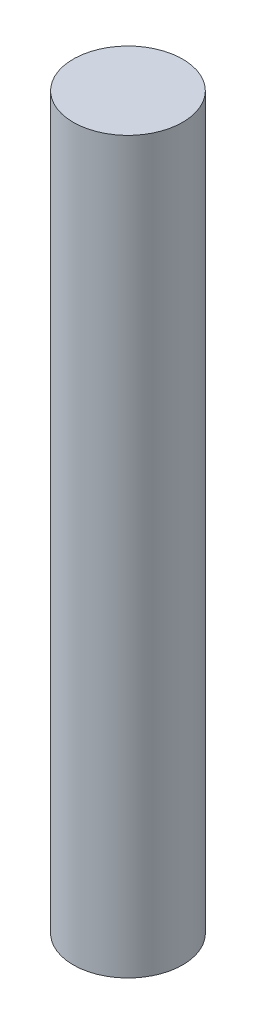
ISO-10303-21;
HEADER;
FILE_DESCRIPTION(('STEP AP214'),'2;1');
FILE_NAME('part.step','',(''),(''),'','','');
FILE_SCHEMA(('AUTOMOTIVE_DESIGN { 1 0 10303 214 1 1 1 1 }'));
ENDSEC;
DATA;
#1=APPLICATION_CONTEXT('core data for automotive mechanical design processes');
#2=APPLICATION_PROTOCOL_DEFINITION('international standard','automotive_design',2000,#1);
#3=PRODUCT_CONTEXT('',#1,'mechanical');
#4=PRODUCT('Part','Part','',(#3));
#5=PRODUCT_RELATED_PRODUCT_CATEGORY('part','',(#4));
#6=PRODUCT_DEFINITION_FORMATION('','',#4);
#7=PRODUCT_DEFINITION_CONTEXT('part definition',#1,'design');
#8=PRODUCT_DEFINITION('design','',#6,#7);
#9=PRODUCT_DEFINITION_SHAPE('','',#8);
#10=(LENGTH_UNIT() NAMED_UNIT(*) SI_UNIT(.MILLI.,.METRE.));
#11=(NAMED_UNIT(*) PLANE_ANGLE_UNIT() SI_UNIT($,.RADIAN.));
#12=(NAMED_UNIT(*) SI_UNIT($,.STERADIAN.) SOLID_ANGLE_UNIT());
#13=UNCERTAINTY_MEASURE_WITH_UNIT(LENGTH_MEASURE(1.E-05),#10,'distance_accuracy_value','');
#14=(GEOMETRIC_REPRESENTATION_CONTEXT(3) GLOBAL_UNCERTAINTY_ASSIGNED_CONTEXT((#13)) GLOBAL_UNIT_ASSIGNED_CONTEXT((#10,
#11,#12)) REPRESENTATION_CONTEXT('',''));
#15=CARTESIAN_POINT('',(0.,0.,0.));
#16=DIRECTION('',(0.,0.,1.));
#17=DIRECTION('',(1.,0.,0.));
#18=AXIS2_PLACEMENT_3D('',#15,#16,#17);
#19=CARTESIAN_POINT('',(0.,10.,0.));
#20=DIRECTION('',(0.,-1.,0.));
#21=DIRECTION('',(0.,0.,-1.));
#22=AXIS2_PLACEMENT_3D('',#19,#20,#21);
#23=CYLINDRICAL_SURFACE('',#22,0.75);
#24=CARTESIAN_POINT('',(0.,10.,0.));
#25=DIRECTION('',(0.,1.,0.));
#26=DIRECTION('',(0.,0.,1.));
#27=AXIS2_PLACEMENT_3D('',#24,#25,#26);
#28=CIRCLE('',#27,0.75);
#29=CARTESIAN_POINT('',(0.,10.,0.75));
#30=VERTEX_POINT('',#29);
#31=EDGE_CURVE('E10',#30,#30,#28,.T.);
#32=ORIENTED_EDGE('',*,*,#31,.F.);
#33=EDGE_LOOP('',(#32));
#34=FACE_BOUND('',#33,.T.);
#35=CARTESIAN_POINT('',(0.,0.,0.));
#36=DIRECTION('',(0.,1.,0.));
#37=DIRECTION('',(0.,0.,1.));
#38=AXIS2_PLACEMENT_3D('',#35,#36,#37);
#39=CIRCLE('',#38,0.75);
#40=CARTESIAN_POINT('',(0.,0.,0.75));
#41=VERTEX_POINT('',#40);
#42=EDGE_CURVE('E38',#41,#41,#39,.T.);
#43=ORIENTED_EDGE('',*,*,#42,.T.);
#44=EDGE_LOOP('',(#43));
#45=FACE_BOUND('',#44,.T.);
#46=ADVANCED_FACE('F35',(#34,#45),#23,.T.);
#47=CARTESIAN_POINT('',(0.,10.,0.));
#48=DIRECTION('',(0.,1.,0.));
#49=DIRECTION('',(0.,0.,1.));
#50=AXIS2_PLACEMENT_3D('',#47,#48,#49);
#51=PLANE('',#50);
#52=ORIENTED_EDGE('',*,*,#31,.T.);
#53=EDGE_LOOP('',(#52));
#54=FACE_BOUND('',#53,.T.);
#55=ADVANCED_FACE('F52',(#54),#51,.T.);
#56=CARTESIAN_POINT('',(0.,0.,0.));
#57=DIRECTION('',(0.,1.,0.));
#58=DIRECTION('',(0.,0.,1.));
#59=AXIS2_PLACEMENT_3D('',#56,#57,#58);
#60=PLANE('',#59);
#61=ORIENTED_EDGE('',*,*,#42,.F.);
#62=EDGE_LOOP('',(#61));
#63=FACE_BOUND('',#62,.T.);
#64=ADVANCED_FACE('F50',(#63),#60,.F.);
#65=CLOSED_SHELL('',(#46,#55,#64));
#66=MANIFOLD_SOLID_BREP('B2',#65);
#67=ADVANCED_BREP_SHAPE_REPRESENTATION('',(#18,#66),#14);
#68=SHAPE_DEFINITION_REPRESENTATION(#9,#67);
ENDSEC;
END-ISO-10303-21;
